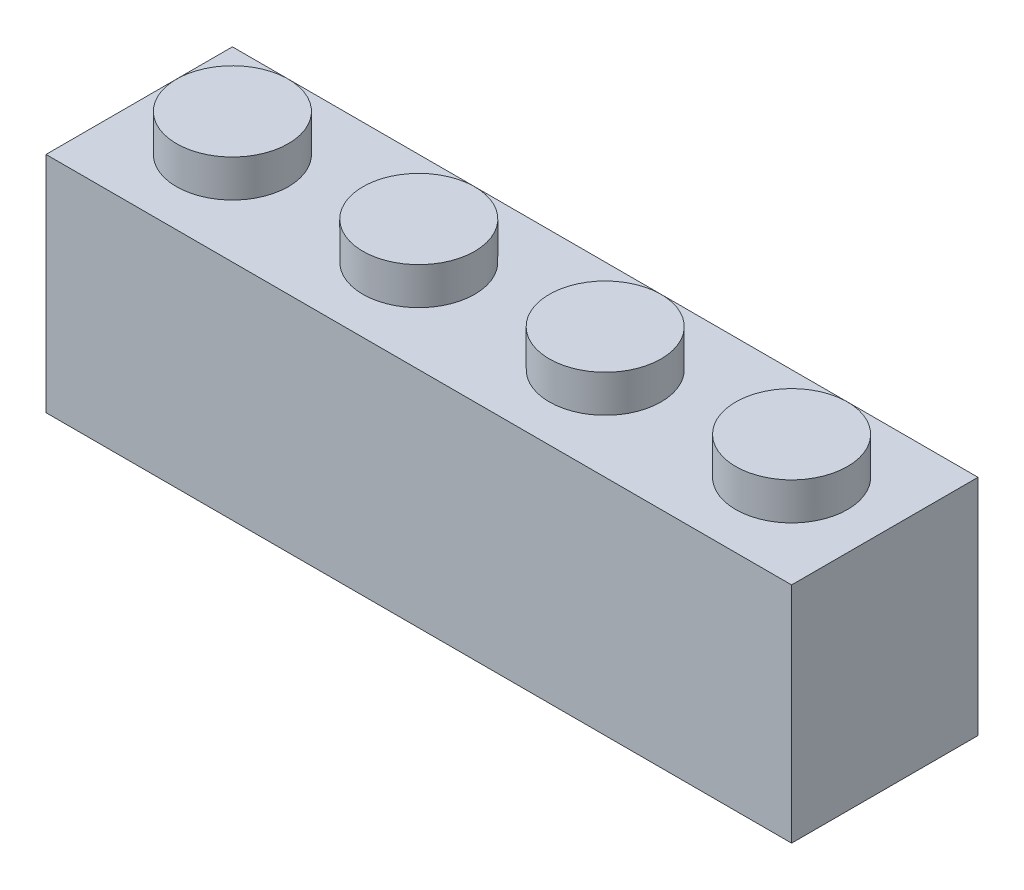
ISO-10303-21;
HEADER;
FILE_DESCRIPTION(('STEP AP214'),'2;1');
FILE_NAME('part.step','',(''),(''),'','','');
FILE_SCHEMA(('AUTOMOTIVE_DESIGN { 1 0 10303 214 1 1 1 1 }'));
ENDSEC;
DATA;
#1=APPLICATION_CONTEXT('core data for automotive mechanical design processes');
#2=APPLICATION_PROTOCOL_DEFINITION('international standard','automotive_design',2000,#1);
#3=PRODUCT_CONTEXT('',#1,'mechanical');
#4=PRODUCT('Part','Part','',(#3));
#5=PRODUCT_RELATED_PRODUCT_CATEGORY('part','',(#4));
#6=PRODUCT_DEFINITION_FORMATION('','',#4);
#7=PRODUCT_DEFINITION_CONTEXT('part definition',#1,'design');
#8=PRODUCT_DEFINITION('design','',#6,#7);
#9=PRODUCT_DEFINITION_SHAPE('','',#8);
#10=(LENGTH_UNIT() NAMED_UNIT(*) SI_UNIT(.MILLI.,.METRE.));
#11=(NAMED_UNIT(*) PLANE_ANGLE_UNIT() SI_UNIT($,.RADIAN.));
#12=(NAMED_UNIT(*) SI_UNIT($,.STERADIAN.) SOLID_ANGLE_UNIT());
#13=UNCERTAINTY_MEASURE_WITH_UNIT(LENGTH_MEASURE(1.E-05),#10,'distance_accuracy_value','');
#14=(GEOMETRIC_REPRESENTATION_CONTEXT(3) GLOBAL_UNCERTAINTY_ASSIGNED_CONTEXT((#13)) GLOBAL_UNIT_ASSIGNED_CONTEXT((#10,
#11,#12)) REPRESENTATION_CONTEXT('',''));
#15=CARTESIAN_POINT('',(0.,0.,0.));
#16=DIRECTION('',(0.,0.,1.));
#17=DIRECTION('',(1.,0.,0.));
#18=AXIS2_PLACEMENT_3D('',#15,#16,#17);
#19=CARTESIAN_POINT('',(28.,4.8,0.));
#20=DIRECTION('',(-1.,0.,0.));
#21=DIRECTION('',(0.,0.,1.));
#22=AXIS2_PLACEMENT_3D('',#19,#20,#21);
#23=PLANE('',#22);
#24=DIRECTION('',(0.,0.,-1.));
#25=VECTOR('',#24,1.);
#26=CARTESIAN_POINT('',(28.,0.,0.));
#27=LINE('',#26,#25);
#28=CARTESIAN_POINT('',(28.,0.,4.));
#29=VERTEX_POINT('',#28);
#30=CARTESIAN_POINT('',(28.,0.,-4.));
#31=VERTEX_POINT('',#30);
#32=EDGE_CURVE('E117',#29,#31,#27,.T.);
#33=ORIENTED_EDGE('',*,*,#32,.T.);
#34=DIRECTION('',(0.,-1.,0.));
#35=VECTOR('',#34,1.);
#36=CARTESIAN_POINT('',(28.,4.8,-4.));
#37=LINE('',#36,#35);
#38=CARTESIAN_POINT('',(28.,9.6,-4.));
#39=VERTEX_POINT('',#38);
#40=EDGE_CURVE('E98',#39,#31,#37,.T.);
#41=ORIENTED_EDGE('',*,*,#40,.F.);
#42=DIRECTION('',(0.,0.,-1.));
#43=VECTOR('',#42,1.);
#44=CARTESIAN_POINT('',(28.,9.6,0.));
#45=LINE('',#44,#43);
#46=CARTESIAN_POINT('',(28.,9.6,4.));
#47=VERTEX_POINT('',#46);
#48=EDGE_CURVE('E11',#47,#39,#45,.T.);
#49=ORIENTED_EDGE('',*,*,#48,.F.);
#50=DIRECTION('',(0.,1.,0.));
#51=VECTOR('',#50,1.);
#52=CARTESIAN_POINT('',(28.,4.8,4.));
#53=LINE('',#52,#51);
#54=EDGE_CURVE('E109',#29,#47,#53,.T.);
#55=ORIENTED_EDGE('',*,*,#54,.F.);
#56=EDGE_LOOP('',(#33,#41,#49,#55));
#57=FACE_BOUND('',#56,.T.);
#58=ADVANCED_FACE('F17',(#57),#23,.F.);
#59=CARTESIAN_POINT('',(12.,9.6,0.));
#60=DIRECTION('',(0.,-1.,0.));
#61=DIRECTION('',(0.,0.,-1.));
#62=AXIS2_PLACEMENT_3D('',#59,#60,#61);
#63=PLANE('',#62);
#64=ORIENTED_EDGE('',*,*,#48,.T.);
#65=DIRECTION('',(1.,0.,0.));
#66=VECTOR('',#65,1.);
#67=CARTESIAN_POINT('',(12.,9.6,-4.));
#68=LINE('',#67,#66);
#69=CARTESIAN_POINT('',(-4.,9.6,-4.));
#70=VERTEX_POINT('',#69);
#71=EDGE_CURVE('E153',#70,#39,#68,.T.);
#72=ORIENTED_EDGE('',*,*,#71,.F.);
#73=DIRECTION('',(0.,0.,-1.));
#74=VECTOR('',#73,1.);
#75=CARTESIAN_POINT('',(-4.,9.6,0.));
#76=LINE('',#75,#74);
#77=CARTESIAN_POINT('',(-4.,9.6,4.));
#78=VERTEX_POINT('',#77);
#79=EDGE_CURVE('E27',#78,#70,#76,.T.);
#80=ORIENTED_EDGE('',*,*,#79,.F.);
#81=DIRECTION('',(-1.,0.,0.));
#82=VECTOR('',#81,1.);
#83=CARTESIAN_POINT('',(12.,9.6,4.));
#84=LINE('',#83,#82);
#85=EDGE_CURVE('E105',#47,#78,#84,.T.);
#86=ORIENTED_EDGE('',*,*,#85,.F.);
#87=EDGE_LOOP('',(#64,#72,#80,#86));
#88=FACE_BOUND('',#87,.T.);
#89=CARTESIAN_POINT('',(0.,9.6,0.));
#90=DIRECTION('',(0.,-1.,0.));
#91=DIRECTION('',(1.,0.,0.));
#92=AXIS2_PLACEMENT_3D('',#89,#90,#91);
#93=CIRCLE('',#92,2.4);
#94=CARTESIAN_POINT('',(-2.4,9.6,0.));
#95=VERTEX_POINT('',#94);
#96=EDGE_CURVE('E139',#95,#95,#93,.T.);
#97=ORIENTED_EDGE('',*,*,#96,.T.);
#98=EDGE_LOOP('',(#97));
#99=FACE_BOUND('',#98,.T.);
#100=CARTESIAN_POINT('',(8.,9.6,0.));
#101=DIRECTION('',(0.,-1.,0.));
#102=DIRECTION('',(1.,0.,0.));
#103=AXIS2_PLACEMENT_3D('',#100,#101,#102);
#104=CIRCLE('',#103,2.4);
#105=CARTESIAN_POINT('',(5.6,9.6,0.));
#106=VERTEX_POINT('',#105);
#107=EDGE_CURVE('E102',#106,#106,#104,.T.);
#108=ORIENTED_EDGE('',*,*,#107,.T.);
#109=EDGE_LOOP('',(#108));
#110=FACE_BOUND('',#109,.T.);
#111=CARTESIAN_POINT('',(16.,9.6,0.));
#112=DIRECTION('',(0.,-1.,0.));
#113=DIRECTION('',(1.,0.,0.));
#114=AXIS2_PLACEMENT_3D('',#111,#112,#113);
#115=CIRCLE('',#114,2.4);
#116=CARTESIAN_POINT('',(13.6,9.6,0.));
#117=VERTEX_POINT('',#116);
#118=EDGE_CURVE('E103',#117,#117,#115,.T.);
#119=ORIENTED_EDGE('',*,*,#118,.T.);
#120=EDGE_LOOP('',(#119));
#121=FACE_BOUND('',#120,.T.);
#122=CARTESIAN_POINT('',(24.,9.6,0.));
#123=DIRECTION('',(0.,-1.,0.));
#124=DIRECTION('',(1.,0.,0.));
#125=AXIS2_PLACEMENT_3D('',#122,#123,#124);
#126=CIRCLE('',#125,2.4);
#127=CARTESIAN_POINT('',(21.6,9.6,0.));
#128=VERTEX_POINT('',#127);
#129=EDGE_CURVE('E125',#128,#128,#126,.T.);
#130=ORIENTED_EDGE('',*,*,#129,.T.);
#131=EDGE_LOOP('',(#130));
#132=FACE_BOUND('',#131,.T.);
#133=ADVANCED_FACE('F178',(#88,#99,#110,#121,#132),#63,.F.);
#134=CARTESIAN_POINT('',(-4.,4.8,0.));
#135=DIRECTION('',(1.,0.,0.));
#136=DIRECTION('',(0.,0.,-1.));
#137=AXIS2_PLACEMENT_3D('',#134,#135,#136);
#138=PLANE('',#137);
#139=ORIENTED_EDGE('',*,*,#79,.T.);
#140=DIRECTION('',(0.,1.,0.));
#141=VECTOR('',#140,1.);
#142=CARTESIAN_POINT('',(-4.,4.8,-4.));
#143=LINE('',#142,#141);
#144=CARTESIAN_POINT('',(-4.,0.,-4.));
#145=VERTEX_POINT('',#144);
#146=EDGE_CURVE('E97',#145,#70,#143,.T.);
#147=ORIENTED_EDGE('',*,*,#146,.F.);
#148=DIRECTION('',(0.,0.,-1.));
#149=VECTOR('',#148,1.);
#150=CARTESIAN_POINT('',(-4.,0.,0.));
#151=LINE('',#150,#149);
#152=CARTESIAN_POINT('',(-4.,0.,4.));
#153=VERTEX_POINT('',#152);
#154=EDGE_CURVE('E119',#153,#145,#151,.T.);
#155=ORIENTED_EDGE('',*,*,#154,.F.);
#156=DIRECTION('',(0.,-1.,0.));
#157=VECTOR('',#156,1.);
#158=CARTESIAN_POINT('',(-4.,4.8,4.));
#159=LINE('',#158,#157);
#160=EDGE_CURVE('E108',#78,#153,#159,.T.);
#161=ORIENTED_EDGE('',*,*,#160,.F.);
#162=EDGE_LOOP('',(#139,#147,#155,#161));
#163=FACE_BOUND('',#162,.T.);
#164=ADVANCED_FACE('F184',(#163),#138,.F.);
#165=CARTESIAN_POINT('',(12.,0.,0.));
#166=DIRECTION('',(0.,1.,0.));
#167=DIRECTION('',(0.,0.,1.));
#168=AXIS2_PLACEMENT_3D('',#165,#166,#167);
#169=PLANE('',#168);
#170=ORIENTED_EDGE('',*,*,#154,.T.);
#171=DIRECTION('',(-1.,0.,0.));
#172=VECTOR('',#171,1.);
#173=CARTESIAN_POINT('',(12.,0.,-4.));
#174=LINE('',#173,#172);
#175=EDGE_CURVE('E95',#31,#145,#174,.T.);
#176=ORIENTED_EDGE('',*,*,#175,.F.);
#177=ORIENTED_EDGE('',*,*,#32,.F.);
#178=DIRECTION('',(1.,0.,0.));
#179=VECTOR('',#178,1.);
#180=CARTESIAN_POINT('',(12.,0.,4.));
#181=LINE('',#180,#179);
#182=EDGE_CURVE('E122',#153,#29,#181,.T.);
#183=ORIENTED_EDGE('',*,*,#182,.F.);
#184=EDGE_LOOP('',(#170,#176,#177,#183));
#185=FACE_BOUND('',#184,.T.);
#186=CARTESIAN_POINT('',(0.,0.,0.));
#187=DIRECTION('',(0.,1.,0.));
#188=DIRECTION('',(1.,0.,0.));
#189=AXIS2_PLACEMENT_3D('',#186,#187,#188);
#190=CIRCLE('',#189,2.4);
#191=CARTESIAN_POINT('',(-2.4,0.,0.));
#192=VERTEX_POINT('',#191);
#193=EDGE_CURVE('E110',#192,#192,#190,.T.);
#194=ORIENTED_EDGE('',*,*,#193,.T.);
#195=EDGE_LOOP('',(#194));
#196=FACE_BOUND('',#195,.T.);
#197=CARTESIAN_POINT('',(8.,0.,0.));
#198=DIRECTION('',(0.,1.,0.));
#199=DIRECTION('',(1.,0.,0.));
#200=AXIS2_PLACEMENT_3D('',#197,#198,#199);
#201=CIRCLE('',#200,2.4);
#202=CARTESIAN_POINT('',(5.6,0.,0.));
#203=VERTEX_POINT('',#202);
#204=EDGE_CURVE('E88',#203,#203,#201,.T.);
#205=ORIENTED_EDGE('',*,*,#204,.T.);
#206=EDGE_LOOP('',(#205));
#207=FACE_BOUND('',#206,.T.);
#208=CARTESIAN_POINT('',(16.,0.,0.));
#209=DIRECTION('',(0.,1.,0.));
#210=DIRECTION('',(1.,0.,0.));
#211=AXIS2_PLACEMENT_3D('',#208,#209,#210);
#212=CIRCLE('',#211,2.4);
#213=CARTESIAN_POINT('',(13.6,0.,0.));
#214=VERTEX_POINT('',#213);
#215=EDGE_CURVE('E81',#214,#214,#212,.T.);
#216=ORIENTED_EDGE('',*,*,#215,.T.);
#217=EDGE_LOOP('',(#216));
#218=FACE_BOUND('',#217,.T.);
#219=CARTESIAN_POINT('',(24.,0.,0.));
#220=DIRECTION('',(0.,1.,0.));
#221=DIRECTION('',(1.,0.,0.));
#222=AXIS2_PLACEMENT_3D('',#219,#220,#221);
#223=CIRCLE('',#222,2.4);
#224=CARTESIAN_POINT('',(21.6,0.,0.));
#225=VERTEX_POINT('',#224);
#226=EDGE_CURVE('E90',#225,#225,#223,.T.);
#227=ORIENTED_EDGE('',*,*,#226,.T.);
#228=EDGE_LOOP('',(#227));
#229=FACE_BOUND('',#228,.T.);
#230=ADVANCED_FACE('F82',(#185,#196,#207,#218,#229),#169,.F.);
#231=CARTESIAN_POINT('',(12.,4.8,-4.));
#232=DIRECTION('',(0.,0.,1.));
#233=DIRECTION('',(1.,0.,0.));
#234=AXIS2_PLACEMENT_3D('',#231,#232,#233);
#235=PLANE('',#234);
#236=ORIENTED_EDGE('',*,*,#40,.T.);
#237=ORIENTED_EDGE('',*,*,#175,.T.);
#238=ORIENTED_EDGE('',*,*,#146,.T.);
#239=ORIENTED_EDGE('',*,*,#71,.T.);
#240=EDGE_LOOP('',(#236,#237,#238,#239));
#241=FACE_BOUND('',#240,.T.);
#242=ADVANCED_FACE('F212',(#241),#235,.F.);
#243=CARTESIAN_POINT('',(12.,4.8,4.));
#244=DIRECTION('',(0.,0.,1.));
#245=DIRECTION('',(1.,0.,0.));
#246=AXIS2_PLACEMENT_3D('',#243,#244,#245);
#247=PLANE('',#246);
#248=ORIENTED_EDGE('',*,*,#54,.T.);
#249=ORIENTED_EDGE('',*,*,#85,.T.);
#250=ORIENTED_EDGE('',*,*,#160,.T.);
#251=ORIENTED_EDGE('',*,*,#182,.T.);
#252=EDGE_LOOP('',(#248,#249,#250,#251));
#253=FACE_BOUND('',#252,.T.);
#254=ADVANCED_FACE('F230',(#253),#247,.T.);
#255=CARTESIAN_POINT('',(0.,11.2,0.));
#256=DIRECTION('',(0.,1.,0.));
#257=DIRECTION('',(1.,0.,0.));
#258=AXIS2_PLACEMENT_3D('',#255,#256,#257);
#259=PLANE('',#258);
#260=CARTESIAN_POINT('',(0.,11.2,0.));
#261=DIRECTION('',(0.,1.,0.));
#262=DIRECTION('',(1.,0.,0.));
#263=AXIS2_PLACEMENT_3D('',#260,#261,#262);
#264=CIRCLE('',#263,2.4);
#265=CARTESIAN_POINT('',(2.4,11.2,0.));
#266=VERTEX_POINT('',#265);
#267=EDGE_CURVE('E137',#266,#266,#264,.T.);
#268=ORIENTED_EDGE('',*,*,#267,.T.);
#269=EDGE_LOOP('',(#268));
#270=FACE_BOUND('',#269,.T.);
#271=ADVANCED_FACE('F225',(#270),#259,.T.);
#272=CARTESIAN_POINT('',(0.,10.15,0.));
#273=DIRECTION('',(0.,-1.,0.));
#274=DIRECTION('',(1.,0.,0.));
#275=AXIS2_PLACEMENT_3D('',#272,#273,#274);
#276=CYLINDRICAL_SURFACE('',#275,2.4);
#277=ORIENTED_EDGE('',*,*,#96,.F.);
#278=EDGE_LOOP('',(#277));
#279=FACE_BOUND('',#278,.T.);
#280=ORIENTED_EDGE('',*,*,#267,.F.);
#281=EDGE_LOOP('',(#280));
#282=FACE_BOUND('',#281,.T.);
#283=ADVANCED_FACE('F205',(#279,#282),#276,.T.);
#284=CARTESIAN_POINT('',(8.,11.2,0.));
#285=DIRECTION('',(0.,1.,0.));
#286=DIRECTION('',(1.,0.,0.));
#287=AXIS2_PLACEMENT_3D('',#284,#285,#286);
#288=PLANE('',#287);
#289=CARTESIAN_POINT('',(8.,11.2,0.));
#290=DIRECTION('',(0.,1.,0.));
#291=DIRECTION('',(1.,0.,0.));
#292=AXIS2_PLACEMENT_3D('',#289,#290,#291);
#293=CIRCLE('',#292,2.4);
#294=CARTESIAN_POINT('',(10.4,11.2,0.));
#295=VERTEX_POINT('',#294);
#296=EDGE_CURVE('E100',#295,#295,#293,.T.);
#297=ORIENTED_EDGE('',*,*,#296,.T.);
#298=EDGE_LOOP('',(#297));
#299=FACE_BOUND('',#298,.T.);
#300=ADVANCED_FACE('F201',(#299),#288,.T.);
#301=CARTESIAN_POINT('',(8.,10.15,0.));
#302=DIRECTION('',(0.,-1.,0.));
#303=DIRECTION('',(1.,0.,0.));
#304=AXIS2_PLACEMENT_3D('',#301,#302,#303);
#305=CYLINDRICAL_SURFACE('',#304,2.4);
#306=ORIENTED_EDGE('',*,*,#107,.F.);
#307=EDGE_LOOP('',(#306));
#308=FACE_BOUND('',#307,.T.);
#309=ORIENTED_EDGE('',*,*,#296,.F.);
#310=EDGE_LOOP('',(#309));
#311=FACE_BOUND('',#310,.T.);
#312=ADVANCED_FACE('F198',(#308,#311),#305,.T.);
#313=CARTESIAN_POINT('',(16.,11.2,0.));
#314=DIRECTION('',(0.,1.,0.));
#315=DIRECTION('',(1.,0.,0.));
#316=AXIS2_PLACEMENT_3D('',#313,#314,#315);
#317=PLANE('',#316);
#318=CARTESIAN_POINT('',(16.,11.2,0.));
#319=DIRECTION('',(0.,1.,0.));
#320=DIRECTION('',(1.,0.,0.));
#321=AXIS2_PLACEMENT_3D('',#318,#319,#320);
#322=CIRCLE('',#321,2.4);
#323=CARTESIAN_POINT('',(18.4,11.2,0.));
#324=VERTEX_POINT('',#323);
#325=EDGE_CURVE('E116',#324,#324,#322,.T.);
#326=ORIENTED_EDGE('',*,*,#325,.T.);
#327=EDGE_LOOP('',(#326));
#328=FACE_BOUND('',#327,.T.);
#329=ADVANCED_FACE('F19',(#328),#317,.T.);
#330=CARTESIAN_POINT('',(16.,10.15,0.));
#331=DIRECTION('',(0.,-1.,0.));
#332=DIRECTION('',(1.,0.,0.));
#333=AXIS2_PLACEMENT_3D('',#330,#331,#332);
#334=CYLINDRICAL_SURFACE('',#333,2.4);
#335=ORIENTED_EDGE('',*,*,#118,.F.);
#336=EDGE_LOOP('',(#335));
#337=FACE_BOUND('',#336,.T.);
#338=ORIENTED_EDGE('',*,*,#325,.F.);
#339=EDGE_LOOP('',(#338));
#340=FACE_BOUND('',#339,.T.);
#341=ADVANCED_FACE('F189',(#337,#340),#334,.T.);
#342=CARTESIAN_POINT('',(24.,11.2,0.));
#343=DIRECTION('',(0.,1.,0.));
#344=DIRECTION('',(1.,0.,0.));
#345=AXIS2_PLACEMENT_3D('',#342,#343,#344);
#346=PLANE('',#345);
#347=CARTESIAN_POINT('',(24.,11.2,0.));
#348=DIRECTION('',(0.,1.,0.));
#349=DIRECTION('',(1.,0.,0.));
#350=AXIS2_PLACEMENT_3D('',#347,#348,#349);
#351=CIRCLE('',#350,2.4);
#352=CARTESIAN_POINT('',(26.4,11.2,0.));
#353=VERTEX_POINT('',#352);
#354=EDGE_CURVE('E21',#353,#353,#351,.T.);
#355=ORIENTED_EDGE('',*,*,#354,.T.);
#356=EDGE_LOOP('',(#355));
#357=FACE_BOUND('',#356,.T.);
#358=ADVANCED_FACE('F191',(#357),#346,.T.);
#359=CARTESIAN_POINT('',(24.,10.15,0.));
#360=DIRECTION('',(0.,-1.,0.));
#361=DIRECTION('',(1.,0.,0.));
#362=AXIS2_PLACEMENT_3D('',#359,#360,#361);
#363=CYLINDRICAL_SURFACE('',#362,2.4);
#364=ORIENTED_EDGE('',*,*,#129,.F.);
#365=EDGE_LOOP('',(#364));
#366=FACE_BOUND('',#365,.T.);
#367=ORIENTED_EDGE('',*,*,#354,.F.);
#368=EDGE_LOOP('',(#367));
#369=FACE_BOUND('',#368,.T.);
#370=ADVANCED_FACE('F194',(#366,#369),#363,.T.);
#371=CARTESIAN_POINT('',(0.,1.6,0.));
#372=DIRECTION('',(0.,1.,0.));
#373=DIRECTION('',(1.,0.,0.));
#374=AXIS2_PLACEMENT_3D('',#371,#372,#373);
#375=PLANE('',#374);
#376=CARTESIAN_POINT('',(0.,1.6,0.));
#377=DIRECTION('',(0.,1.,0.));
#378=DIRECTION('',(1.,0.,0.));
#379=AXIS2_PLACEMENT_3D('',#376,#377,#378);
#380=CIRCLE('',#379,2.4);
#381=CARTESIAN_POINT('',(2.4,1.6,0.));
#382=VERTEX_POINT('',#381);
#383=EDGE_CURVE('E113',#382,#382,#380,.T.);
#384=ORIENTED_EDGE('',*,*,#383,.F.);
#385=EDGE_LOOP('',(#384));
#386=FACE_BOUND('',#385,.T.);
#387=ADVANCED_FACE('F174',(#386),#375,.F.);
#388=CARTESIAN_POINT('',(0.,0.55,0.));
#389=DIRECTION('',(0.,-1.,0.));
#390=DIRECTION('',(1.,0.,0.));
#391=AXIS2_PLACEMENT_3D('',#388,#389,#390);
#392=CYLINDRICAL_SURFACE('',#391,2.4);
#393=ORIENTED_EDGE('',*,*,#383,.T.);
#394=EDGE_LOOP('',(#393));
#395=FACE_BOUND('',#394,.T.);
#396=ORIENTED_EDGE('',*,*,#193,.F.);
#397=EDGE_LOOP('',(#396));
#398=FACE_BOUND('',#397,.T.);
#399=ADVANCED_FACE('F166',(#395,#398),#392,.F.);
#400=CARTESIAN_POINT('',(8.,1.6,0.));
#401=DIRECTION('',(0.,1.,0.));
#402=DIRECTION('',(1.,0.,0.));
#403=AXIS2_PLACEMENT_3D('',#400,#401,#402);
#404=PLANE('',#403);
#405=CARTESIAN_POINT('',(8.,1.6,0.));
#406=DIRECTION('',(0.,1.,0.));
#407=DIRECTION('',(1.,0.,0.));
#408=AXIS2_PLACEMENT_3D('',#405,#406,#407);
#409=CIRCLE('',#408,2.4);
#410=CARTESIAN_POINT('',(10.4,1.6,0.));
#411=VERTEX_POINT('',#410);
#412=EDGE_CURVE('E114',#411,#411,#409,.T.);
#413=ORIENTED_EDGE('',*,*,#412,.F.);
#414=EDGE_LOOP('',(#413));
#415=FACE_BOUND('',#414,.T.);
#416=ADVANCED_FACE('F164',(#415),#404,.F.);
#417=CARTESIAN_POINT('',(8.,0.55,0.));
#418=DIRECTION('',(0.,-1.,0.));
#419=DIRECTION('',(1.,0.,0.));
#420=AXIS2_PLACEMENT_3D('',#417,#418,#419);
#421=CYLINDRICAL_SURFACE('',#420,2.4);
#422=ORIENTED_EDGE('',*,*,#412,.T.);
#423=EDGE_LOOP('',(#422));
#424=FACE_BOUND('',#423,.T.);
#425=ORIENTED_EDGE('',*,*,#204,.F.);
#426=EDGE_LOOP('',(#425));
#427=FACE_BOUND('',#426,.T.);
#428=ADVANCED_FACE('F160',(#424,#427),#421,.F.);
#429=CARTESIAN_POINT('',(16.,1.6,0.));
#430=DIRECTION('',(0.,1.,0.));
#431=DIRECTION('',(1.,0.,0.));
#432=AXIS2_PLACEMENT_3D('',#429,#430,#431);
#433=PLANE('',#432);
#434=CARTESIAN_POINT('',(16.,1.6,0.));
#435=DIRECTION('',(0.,1.,0.));
#436=DIRECTION('',(1.,0.,0.));
#437=AXIS2_PLACEMENT_3D('',#434,#435,#436);
#438=CIRCLE('',#437,2.4);
#439=CARTESIAN_POINT('',(18.4,1.6,0.));
#440=VERTEX_POINT('',#439);
#441=EDGE_CURVE('E85',#440,#440,#438,.T.);
#442=ORIENTED_EDGE('',*,*,#441,.F.);
#443=EDGE_LOOP('',(#442));
#444=FACE_BOUND('',#443,.T.);
#445=ADVANCED_FACE('F172',(#444),#433,.F.);
#446=CARTESIAN_POINT('',(16.,0.55,0.));
#447=DIRECTION('',(0.,-1.,0.));
#448=DIRECTION('',(1.,0.,0.));
#449=AXIS2_PLACEMENT_3D('',#446,#447,#448);
#450=CYLINDRICAL_SURFACE('',#449,2.4);
#451=ORIENTED_EDGE('',*,*,#441,.T.);
#452=EDGE_LOOP('',(#451));
#453=FACE_BOUND('',#452,.T.);
#454=ORIENTED_EDGE('',*,*,#215,.F.);
#455=EDGE_LOOP('',(#454));
#456=FACE_BOUND('',#455,.T.);
#457=ADVANCED_FACE('F214',(#453,#456),#450,.F.);
#458=CARTESIAN_POINT('',(24.,1.6,0.));
#459=DIRECTION('',(0.,1.,0.));
#460=DIRECTION('',(1.,0.,0.));
#461=AXIS2_PLACEMENT_3D('',#458,#459,#460);
#462=PLANE('',#461);
#463=CARTESIAN_POINT('',(24.,1.6,0.));
#464=DIRECTION('',(0.,1.,0.));
#465=DIRECTION('',(1.,0.,0.));
#466=AXIS2_PLACEMENT_3D('',#463,#464,#465);
#467=CIRCLE('',#466,2.4);
#468=CARTESIAN_POINT('',(26.4,1.6,0.));
#469=VERTEX_POINT('',#468);
#470=EDGE_CURVE('E86',#469,#469,#467,.T.);
#471=ORIENTED_EDGE('',*,*,#470,.F.);
#472=EDGE_LOOP('',(#471));
#473=FACE_BOUND('',#472,.T.);
#474=ADVANCED_FACE('F217',(#473),#462,.F.);
#475=CARTESIAN_POINT('',(24.,0.55,0.));
#476=DIRECTION('',(0.,-1.,0.));
#477=DIRECTION('',(1.,0.,0.));
#478=AXIS2_PLACEMENT_3D('',#475,#476,#477);
#479=CYLINDRICAL_SURFACE('',#478,2.4);
#480=ORIENTED_EDGE('',*,*,#470,.T.);
#481=EDGE_LOOP('',(#480));
#482=FACE_BOUND('',#481,.T.);
#483=ORIENTED_EDGE('',*,*,#226,.F.);
#484=EDGE_LOOP('',(#483));
#485=FACE_BOUND('',#484,.T.);
#486=ADVANCED_FACE('F221',(#482,#485),#479,.F.);
#487=CLOSED_SHELL('',(#58,#133,#164,#230,#242,#254,#271,#283,#300,#312,#329,#341,#358,#370,#387,
#399,#416,#428,#445,#457,#474,#486));
#488=MANIFOLD_SOLID_BREP('B1',#487);
#489=ADVANCED_BREP_SHAPE_REPRESENTATION('',(#18,#488),#14);
#490=SHAPE_DEFINITION_REPRESENTATION(#9,#489);
ENDSEC;
END-ISO-10303-21;
